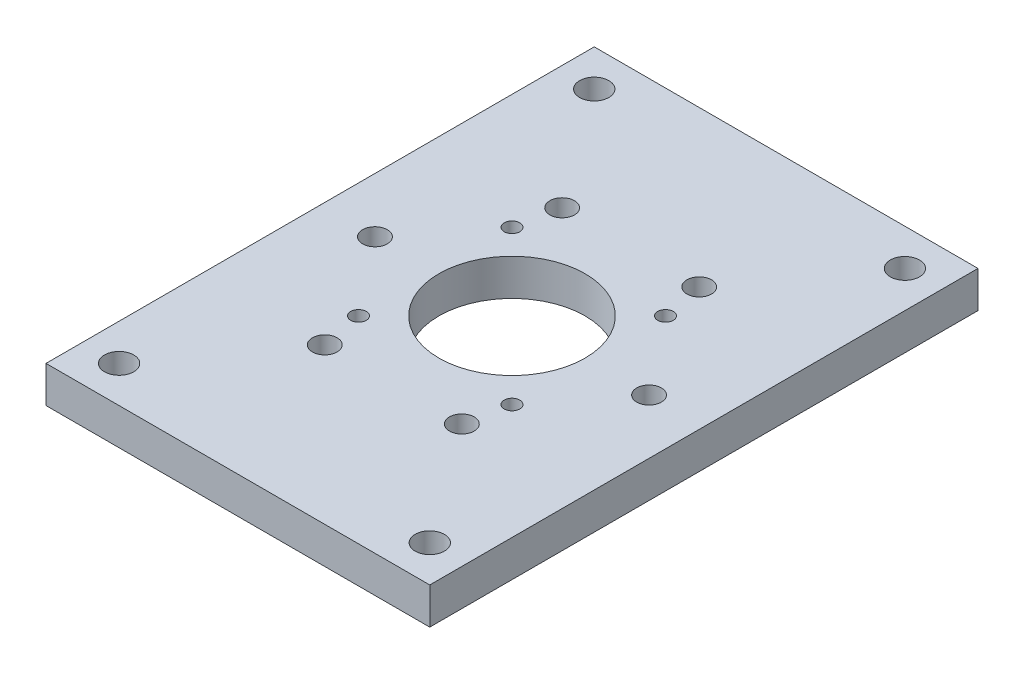
ISO-10303-21;
HEADER;
FILE_DESCRIPTION(('STEP AP214'),'2;1');
FILE_NAME('part.step','',(''),(''),'','','');
FILE_SCHEMA(('AUTOMOTIVE_DESIGN { 1 0 10303 214 1 1 1 1 }'));
ENDSEC;
DATA;
#1=APPLICATION_CONTEXT('core data for automotive mechanical design processes');
#2=APPLICATION_PROTOCOL_DEFINITION('international standard','automotive_design',2000,#1);
#3=PRODUCT_CONTEXT('',#1,'mechanical');
#4=PRODUCT('Part','Part','',(#3));
#5=PRODUCT_RELATED_PRODUCT_CATEGORY('part','',(#4));
#6=PRODUCT_DEFINITION_FORMATION('','',#4);
#7=PRODUCT_DEFINITION_CONTEXT('part definition',#1,'design');
#8=PRODUCT_DEFINITION('design','',#6,#7);
#9=PRODUCT_DEFINITION_SHAPE('','',#8);
#10=(LENGTH_UNIT() NAMED_UNIT(*) SI_UNIT(.MILLI.,.METRE.));
#11=(NAMED_UNIT(*) PLANE_ANGLE_UNIT() SI_UNIT($,.RADIAN.));
#12=(NAMED_UNIT(*) SI_UNIT($,.STERADIAN.) SOLID_ANGLE_UNIT());
#13=UNCERTAINTY_MEASURE_WITH_UNIT(LENGTH_MEASURE(1.E-05),#10,'distance_accuracy_value','');
#14=(GEOMETRIC_REPRESENTATION_CONTEXT(3) GLOBAL_UNCERTAINTY_ASSIGNED_CONTEXT((#13)) GLOBAL_UNIT_ASSIGNED_CONTEXT((#10,
#11,#12)) REPRESENTATION_CONTEXT('',''));
#15=CARTESIAN_POINT('',(0.,0.,0.));
#16=DIRECTION('',(0.,0.,1.));
#17=DIRECTION('',(1.,0.,0.));
#18=AXIS2_PLACEMENT_3D('',#15,#16,#17);
#19=CARTESIAN_POINT('',(0.,20.,0.));
#20=DIRECTION('',(0.,-1.,0.));
#21=DIRECTION('',(0.,0.,-1.));
#22=AXIS2_PLACEMENT_3D('',#19,#20,#21);
#23=PLANE('',#22);
#24=CARTESIAN_POINT('',(-41.9999999999996,20.,42.0000000000005));
#25=DIRECTION('',(0.,1.,0.));
#26=DIRECTION('',(0.,0.,1.));
#27=AXIS2_PLACEMENT_3D('',#24,#25,#26);
#28=CIRCLE('',#27,4.25);
#29=CARTESIAN_POINT('',(-41.9999999999996,20.,46.2500000000005));
#30=VERTEX_POINT('',#29);
#31=EDGE_CURVE('E19',#30,#30,#28,.F.);
#32=ORIENTED_EDGE('',*,*,#31,.T.);
#33=EDGE_LOOP('',(#32));
#34=FACE_BOUND('',#33,.T.);
#35=CARTESIAN_POINT('',(-42.,20.,-42.));
#36=DIRECTION('',(0.,1.,0.));
#37=DIRECTION('',(0.,0.,1.));
#38=AXIS2_PLACEMENT_3D('',#35,#36,#37);
#39=CIRCLE('',#38,4.25);
#40=CARTESIAN_POINT('',(-42.,20.,-37.75));
#41=VERTEX_POINT('',#40);
#42=EDGE_CURVE('E166',#41,#41,#39,.F.);
#43=ORIENTED_EDGE('',*,*,#42,.T.);
#44=EDGE_LOOP('',(#43));
#45=FACE_BOUND('',#44,.T.);
#46=CARTESIAN_POINT('',(42.,20.,-42.));
#47=DIRECTION('',(0.,1.,0.));
#48=DIRECTION('',(0.,0.,1.));
#49=AXIS2_PLACEMENT_3D('',#46,#47,#48);
#50=CIRCLE('',#49,4.25);
#51=CARTESIAN_POINT('',(42.,20.,-37.75));
#52=VERTEX_POINT('',#51);
#53=EDGE_CURVE('E164',#52,#52,#50,.F.);
#54=ORIENTED_EDGE('',*,*,#53,.T.);
#55=EDGE_LOOP('',(#54));
#56=FACE_BOUND('',#55,.T.);
#57=CARTESIAN_POINT('',(42.,20.,42.));
#58=DIRECTION('',(0.,1.,0.));
#59=DIRECTION('',(0.,0.,1.));
#60=AXIS2_PLACEMENT_3D('',#57,#58,#59);
#61=CIRCLE('',#60,4.25);
#62=CARTESIAN_POINT('',(42.,20.,46.25));
#63=VERTEX_POINT('',#62);
#64=EDGE_CURVE('E161',#63,#63,#61,.F.);
#65=ORIENTED_EDGE('',*,*,#64,.T.);
#66=EDGE_LOOP('',(#65));
#67=FACE_BOUND('',#66,.T.);
#68=CARTESIAN_POINT('',(-37.5000000000007,20.,-64.9519052838323));
#69=DIRECTION('',(0.,1.,0.));
#70=DIRECTION('',(0.,0.,1.));
#71=AXIS2_PLACEMENT_3D('',#68,#69,#70);
#72=CIRCLE('',#71,6.75);
#73=CARTESIAN_POINT('',(-37.5000000000007,20.,-58.2019052838323));
#74=VERTEX_POINT('',#73);
#75=EDGE_CURVE('E158',#74,#74,#72,.F.);
#76=ORIENTED_EDGE('',*,*,#75,.T.);
#77=EDGE_LOOP('',(#76));
#78=FACE_BOUND('',#77,.T.);
#79=CARTESIAN_POINT('',(37.4999999999993,20.,-64.9519052838331));
#80=DIRECTION('',(0.,1.,0.));
#81=DIRECTION('',(0.,0.,1.));
#82=AXIS2_PLACEMENT_3D('',#79,#80,#81);
#83=CIRCLE('',#82,6.75);
#84=CARTESIAN_POINT('',(37.4999999999993,20.,-58.2019052838331));
#85=VERTEX_POINT('',#84);
#86=EDGE_CURVE('E155',#85,#85,#83,.F.);
#87=ORIENTED_EDGE('',*,*,#86,.T.);
#88=EDGE_LOOP('',(#87));
#89=FACE_BOUND('',#88,.T.);
#90=CARTESIAN_POINT('',(75.,20.,0.));
#91=DIRECTION('',(0.,1.,0.));
#92=DIRECTION('',(0.,0.,1.));
#93=AXIS2_PLACEMENT_3D('',#90,#91,#92);
#94=CIRCLE('',#93,6.75);
#95=CARTESIAN_POINT('',(75.,20.,6.74999999999997));
#96=VERTEX_POINT('',#95);
#97=EDGE_CURVE('E152',#96,#96,#94,.F.);
#98=ORIENTED_EDGE('',*,*,#97,.T.);
#99=EDGE_LOOP('',(#98));
#100=FACE_BOUND('',#99,.T.);
#101=DIRECTION('',(1.,0.,0.));
#102=VECTOR('',#101,1.);
#103=CARTESIAN_POINT('',(-105.,20.,-150.));
#104=LINE('',#103,#102);
#105=CARTESIAN_POINT('',(105.,20.,-150.));
#106=VERTEX_POINT('',#105);
#107=CARTESIAN_POINT('',(-105.,20.,-150.));
#108=VERTEX_POINT('',#107);
#109=EDGE_CURVE('E453',#106,#108,#104,.F.);
#110=ORIENTED_EDGE('',*,*,#109,.T.);
#111=DIRECTION('',(0.,0.,-1.));
#112=VECTOR('',#111,1.);
#113=CARTESIAN_POINT('',(-105.,20.,150.));
#114=LINE('',#113,#112);
#115=CARTESIAN_POINT('',(-105.,20.,150.));
#116=VERTEX_POINT('',#115);
#117=EDGE_CURVE('E54',#108,#116,#114,.F.);
#118=ORIENTED_EDGE('',*,*,#117,.T.);
#119=DIRECTION('',(-1.,0.,0.));
#120=VECTOR('',#119,1.);
#121=CARTESIAN_POINT('',(-105.,20.,150.));
#122=LINE('',#121,#120);
#123=CARTESIAN_POINT('',(105.,20.,150.));
#124=VERTEX_POINT('',#123);
#125=EDGE_CURVE('E56',#116,#124,#122,.F.);
#126=ORIENTED_EDGE('',*,*,#125,.T.);
#127=DIRECTION('',(0.,0.,1.));
#128=VECTOR('',#127,1.);
#129=CARTESIAN_POINT('',(105.,20.,150.));
#130=LINE('',#129,#128);
#131=EDGE_CURVE('E59',#124,#106,#130,.F.);
#132=ORIENTED_EDGE('',*,*,#131,.T.);
#133=EDGE_LOOP('',(#110,#118,#126,#132));
#134=FACE_BOUND('',#133,.T.);
#135=CARTESIAN_POINT('',(0.,20.,0.));
#136=DIRECTION('',(0.,1.,0.));
#137=DIRECTION('',(0.,0.,1.));
#138=AXIS2_PLACEMENT_3D('',#135,#136,#137);
#139=CIRCLE('',#138,40.);
#140=CARTESIAN_POINT('',(0.,20.,40.));
#141=VERTEX_POINT('',#140);
#142=EDGE_CURVE('E72',#141,#141,#139,.F.);
#143=ORIENTED_EDGE('',*,*,#142,.T.);
#144=EDGE_LOOP('',(#143));
#145=FACE_BOUND('',#144,.T.);
#146=CARTESIAN_POINT('',(-85.,20.,-130.));
#147=DIRECTION('',(0.,1.,0.));
#148=DIRECTION('',(0.,0.,1.));
#149=AXIS2_PLACEMENT_3D('',#146,#147,#148);
#150=CIRCLE('',#149,8.);
#151=CARTESIAN_POINT('',(-85.,20.,-122.));
#152=VERTEX_POINT('',#151);
#153=EDGE_CURVE('E131',#152,#152,#150,.F.);
#154=ORIENTED_EDGE('',*,*,#153,.T.);
#155=EDGE_LOOP('',(#154));
#156=FACE_BOUND('',#155,.T.);
#157=CARTESIAN_POINT('',(-85.,20.,130.));
#158=DIRECTION('',(0.,1.,0.));
#159=DIRECTION('',(0.,0.,1.));
#160=AXIS2_PLACEMENT_3D('',#157,#158,#159);
#161=CIRCLE('',#160,8.);
#162=CARTESIAN_POINT('',(-85.,20.,138.));
#163=VERTEX_POINT('',#162);
#164=EDGE_CURVE('E134',#163,#163,#161,.F.);
#165=ORIENTED_EDGE('',*,*,#164,.T.);
#166=EDGE_LOOP('',(#165));
#167=FACE_BOUND('',#166,.T.);
#168=CARTESIAN_POINT('',(85.,20.,-130.));
#169=DIRECTION('',(0.,1.,0.));
#170=DIRECTION('',(0.,0.,1.));
#171=AXIS2_PLACEMENT_3D('',#168,#169,#170);
#172=CIRCLE('',#171,8.);
#173=CARTESIAN_POINT('',(85.,20.,-122.));
#174=VERTEX_POINT('',#173);
#175=EDGE_CURVE('E137',#174,#174,#172,.F.);
#176=ORIENTED_EDGE('',*,*,#175,.T.);
#177=EDGE_LOOP('',(#176));
#178=FACE_BOUND('',#177,.T.);
#179=CARTESIAN_POINT('',(85.,20.,130.));
#180=DIRECTION('',(0.,1.,0.));
#181=DIRECTION('',(0.,0.,1.));
#182=AXIS2_PLACEMENT_3D('',#179,#180,#181);
#183=CIRCLE('',#182,8.);
#184=CARTESIAN_POINT('',(85.,20.,138.));
#185=VERTEX_POINT('',#184);
#186=EDGE_CURVE('E140',#185,#185,#183,.F.);
#187=ORIENTED_EDGE('',*,*,#186,.T.);
#188=EDGE_LOOP('',(#187));
#189=FACE_BOUND('',#188,.T.);
#190=CARTESIAN_POINT('',(-75.,20.,0.));
#191=DIRECTION('',(0.,1.,0.));
#192=DIRECTION('',(0.,0.,1.));
#193=AXIS2_PLACEMENT_3D('',#190,#191,#192);
#194=CIRCLE('',#193,6.75);
#195=CARTESIAN_POINT('',(-75.,20.,6.75000000000003));
#196=VERTEX_POINT('',#195);
#197=EDGE_CURVE('E143',#196,#196,#194,.F.);
#198=ORIENTED_EDGE('',*,*,#197,.T.);
#199=EDGE_LOOP('',(#198));
#200=FACE_BOUND('',#199,.T.);
#201=CARTESIAN_POINT('',(-37.5,20.,64.9519052838329));
#202=DIRECTION('',(0.,1.,0.));
#203=DIRECTION('',(0.,0.,1.));
#204=AXIS2_PLACEMENT_3D('',#201,#202,#203);
#205=CIRCLE('',#204,6.75);
#206=CARTESIAN_POINT('',(-37.5,20.,71.7019052838329));
#207=VERTEX_POINT('',#206);
#208=EDGE_CURVE('E146',#207,#207,#205,.F.);
#209=ORIENTED_EDGE('',*,*,#208,.T.);
#210=EDGE_LOOP('',(#209));
#211=FACE_BOUND('',#210,.T.);
#212=CARTESIAN_POINT('',(37.5,20.,64.9519052838326));
#213=DIRECTION('',(0.,1.,0.));
#214=DIRECTION('',(0.,0.,1.));
#215=AXIS2_PLACEMENT_3D('',#212,#213,#214);
#216=CIRCLE('',#215,6.75);
#217=CARTESIAN_POINT('',(37.5,20.,71.7019052838326));
#218=VERTEX_POINT('',#217);
#219=EDGE_CURVE('E149',#218,#218,#216,.F.);
#220=ORIENTED_EDGE('',*,*,#219,.T.);
#221=EDGE_LOOP('',(#220));
#222=FACE_BOUND('',#221,.T.);
#223=ADVANCED_FACE('F16',(#34,#45,#56,#67,#78,#89,#100,#134,#145,#156,#167,#178,#189,#200,#211,
#222),#23,.F.);
#224=CARTESIAN_POINT('',(-41.9999999999996,20.,42.0000000000005));
#225=DIRECTION('',(0.,1.,0.));
#226=DIRECTION('',(0.,0.,1.));
#227=AXIS2_PLACEMENT_3D('',#224,#225,#226);
#228=CYLINDRICAL_SURFACE('',#227,4.25);
#229=CARTESIAN_POINT('',(-41.9999999999996,0.,42.0000000000005));
#230=DIRECTION('',(0.,1.,0.));
#231=DIRECTION('',(0.,0.,1.));
#232=AXIS2_PLACEMENT_3D('',#229,#230,#231);
#233=CIRCLE('',#232,4.25);
#234=CARTESIAN_POINT('',(-41.9999999999996,0.,46.2500000000005));
#235=VERTEX_POINT('',#234);
#236=EDGE_CURVE('E126',#235,#235,#233,.T.);
#237=ORIENTED_EDGE('',*,*,#236,.F.);
#238=EDGE_LOOP('',(#237));
#239=FACE_BOUND('',#238,.T.);
#240=ORIENTED_EDGE('',*,*,#31,.F.);
#241=EDGE_LOOP('',(#240));
#242=FACE_BOUND('',#241,.T.);
#243=ADVANCED_FACE('F174',(#239,#242),#228,.F.);
#244=CARTESIAN_POINT('',(-42.,20.,-42.));
#245=DIRECTION('',(0.,1.,0.));
#246=DIRECTION('',(0.,0.,1.));
#247=AXIS2_PLACEMENT_3D('',#244,#245,#246);
#248=CYLINDRICAL_SURFACE('',#247,4.25);
#249=CARTESIAN_POINT('',(-42.,0.,-42.));
#250=DIRECTION('',(0.,1.,0.));
#251=DIRECTION('',(0.,0.,1.));
#252=AXIS2_PLACEMENT_3D('',#249,#250,#251);
#253=CIRCLE('',#252,4.25);
#254=CARTESIAN_POINT('',(-42.,0.,-37.75));
#255=VERTEX_POINT('',#254);
#256=EDGE_CURVE('E123',#255,#255,#253,.T.);
#257=ORIENTED_EDGE('',*,*,#256,.F.);
#258=EDGE_LOOP('',(#257));
#259=FACE_BOUND('',#258,.T.);
#260=ORIENTED_EDGE('',*,*,#42,.F.);
#261=EDGE_LOOP('',(#260));
#262=FACE_BOUND('',#261,.T.);
#263=ADVANCED_FACE('F176',(#259,#262),#248,.F.);
#264=CARTESIAN_POINT('',(42.,20.,-42.));
#265=DIRECTION('',(0.,1.,0.));
#266=DIRECTION('',(0.,0.,1.));
#267=AXIS2_PLACEMENT_3D('',#264,#265,#266);
#268=CYLINDRICAL_SURFACE('',#267,4.25);
#269=CARTESIAN_POINT('',(42.,0.,-42.));
#270=DIRECTION('',(0.,1.,0.));
#271=DIRECTION('',(0.,0.,1.));
#272=AXIS2_PLACEMENT_3D('',#269,#270,#271);
#273=CIRCLE('',#272,4.25);
#274=CARTESIAN_POINT('',(42.,0.,-37.75));
#275=VERTEX_POINT('',#274);
#276=EDGE_CURVE('E120',#275,#275,#273,.T.);
#277=ORIENTED_EDGE('',*,*,#276,.F.);
#278=EDGE_LOOP('',(#277));
#279=FACE_BOUND('',#278,.T.);
#280=ORIENTED_EDGE('',*,*,#53,.F.);
#281=EDGE_LOOP('',(#280));
#282=FACE_BOUND('',#281,.T.);
#283=ADVANCED_FACE('F184',(#279,#282),#268,.F.);
#284=CARTESIAN_POINT('',(42.,20.,42.));
#285=DIRECTION('',(0.,1.,0.));
#286=DIRECTION('',(0.,0.,1.));
#287=AXIS2_PLACEMENT_3D('',#284,#285,#286);
#288=CYLINDRICAL_SURFACE('',#287,4.25);
#289=CARTESIAN_POINT('',(42.,0.,42.));
#290=DIRECTION('',(0.,1.,0.));
#291=DIRECTION('',(0.,0.,1.));
#292=AXIS2_PLACEMENT_3D('',#289,#290,#291);
#293=CIRCLE('',#292,4.25);
#294=CARTESIAN_POINT('',(42.,0.,46.25));
#295=VERTEX_POINT('',#294);
#296=EDGE_CURVE('E117',#295,#295,#293,.T.);
#297=ORIENTED_EDGE('',*,*,#296,.F.);
#298=EDGE_LOOP('',(#297));
#299=FACE_BOUND('',#298,.T.);
#300=ORIENTED_EDGE('',*,*,#64,.F.);
#301=EDGE_LOOP('',(#300));
#302=FACE_BOUND('',#301,.T.);
#303=ADVANCED_FACE('F252',(#299,#302),#288,.F.);
#304=CARTESIAN_POINT('',(-37.5000000000007,20.,-64.9519052838323));
#305=DIRECTION('',(0.,1.,0.));
#306=DIRECTION('',(0.,0.,1.));
#307=AXIS2_PLACEMENT_3D('',#304,#305,#306);
#308=CYLINDRICAL_SURFACE('',#307,6.75);
#309=ORIENTED_EDGE('',*,*,#75,.F.);
#310=EDGE_LOOP('',(#309));
#311=FACE_BOUND('',#310,.T.);
#312=CARTESIAN_POINT('',(-37.5000000000007,0.,-64.9519052838323));
#313=DIRECTION('',(0.,1.,0.));
#314=DIRECTION('',(0.,0.,1.));
#315=AXIS2_PLACEMENT_3D('',#312,#313,#314);
#316=CIRCLE('',#315,6.75);
#317=CARTESIAN_POINT('',(-37.5000000000007,0.,-58.2019052838323));
#318=VERTEX_POINT('',#317);
#319=EDGE_CURVE('E114',#318,#318,#316,.T.);
#320=ORIENTED_EDGE('',*,*,#319,.F.);
#321=EDGE_LOOP('',(#320));
#322=FACE_BOUND('',#321,.T.);
#323=ADVANCED_FACE('F248',(#311,#322),#308,.F.);
#324=CARTESIAN_POINT('',(37.4999999999993,20.,-64.9519052838331));
#325=DIRECTION('',(0.,1.,0.));
#326=DIRECTION('',(0.,0.,1.));
#327=AXIS2_PLACEMENT_3D('',#324,#325,#326);
#328=CYLINDRICAL_SURFACE('',#327,6.75);
#329=ORIENTED_EDGE('',*,*,#86,.F.);
#330=EDGE_LOOP('',(#329));
#331=FACE_BOUND('',#330,.T.);
#332=CARTESIAN_POINT('',(37.4999999999993,0.,-64.9519052838331));
#333=DIRECTION('',(0.,1.,0.));
#334=DIRECTION('',(0.,0.,1.));
#335=AXIS2_PLACEMENT_3D('',#332,#333,#334);
#336=CIRCLE('',#335,6.75);
#337=CARTESIAN_POINT('',(37.4999999999993,0.,-58.2019052838331));
#338=VERTEX_POINT('',#337);
#339=EDGE_CURVE('E111',#338,#338,#336,.T.);
#340=ORIENTED_EDGE('',*,*,#339,.F.);
#341=EDGE_LOOP('',(#340));
#342=FACE_BOUND('',#341,.T.);
#343=ADVANCED_FACE('F244',(#331,#342),#328,.F.);
#344=CARTESIAN_POINT('',(75.,20.,0.));
#345=DIRECTION('',(0.,1.,0.));
#346=DIRECTION('',(0.,0.,1.));
#347=AXIS2_PLACEMENT_3D('',#344,#345,#346);
#348=CYLINDRICAL_SURFACE('',#347,6.75);
#349=ORIENTED_EDGE('',*,*,#97,.F.);
#350=EDGE_LOOP('',(#349));
#351=FACE_BOUND('',#350,.T.);
#352=CARTESIAN_POINT('',(75.,0.,0.));
#353=DIRECTION('',(0.,1.,0.));
#354=DIRECTION('',(0.,0.,1.));
#355=AXIS2_PLACEMENT_3D('',#352,#353,#354);
#356=CIRCLE('',#355,6.75);
#357=CARTESIAN_POINT('',(75.,0.,6.74999999999997));
#358=VERTEX_POINT('',#357);
#359=EDGE_CURVE('E108',#358,#358,#356,.T.);
#360=ORIENTED_EDGE('',*,*,#359,.F.);
#361=EDGE_LOOP('',(#360));
#362=FACE_BOUND('',#361,.T.);
#363=ADVANCED_FACE('F240',(#351,#362),#348,.F.);
#364=CARTESIAN_POINT('',(37.5,20.,64.9519052838326));
#365=DIRECTION('',(0.,1.,0.));
#366=DIRECTION('',(0.,0.,1.));
#367=AXIS2_PLACEMENT_3D('',#364,#365,#366);
#368=CYLINDRICAL_SURFACE('',#367,6.75);
#369=ORIENTED_EDGE('',*,*,#219,.F.);
#370=EDGE_LOOP('',(#369));
#371=FACE_BOUND('',#370,.T.);
#372=CARTESIAN_POINT('',(37.5,0.,64.9519052838326));
#373=DIRECTION('',(0.,1.,0.));
#374=DIRECTION('',(0.,0.,1.));
#375=AXIS2_PLACEMENT_3D('',#372,#373,#374);
#376=CIRCLE('',#375,6.75);
#377=CARTESIAN_POINT('',(37.5,0.,71.7019052838326));
#378=VERTEX_POINT('',#377);
#379=EDGE_CURVE('E105',#378,#378,#376,.T.);
#380=ORIENTED_EDGE('',*,*,#379,.F.);
#381=EDGE_LOOP('',(#380));
#382=FACE_BOUND('',#381,.T.);
#383=ADVANCED_FACE('F236',(#371,#382),#368,.F.);
#384=CARTESIAN_POINT('',(-37.5,20.,64.9519052838329));
#385=DIRECTION('',(0.,1.,0.));
#386=DIRECTION('',(0.,0.,1.));
#387=AXIS2_PLACEMENT_3D('',#384,#385,#386);
#388=CYLINDRICAL_SURFACE('',#387,6.75);
#389=ORIENTED_EDGE('',*,*,#208,.F.);
#390=EDGE_LOOP('',(#389));
#391=FACE_BOUND('',#390,.T.);
#392=CARTESIAN_POINT('',(-37.5,0.,64.9519052838329));
#393=DIRECTION('',(0.,1.,0.));
#394=DIRECTION('',(0.,0.,1.));
#395=AXIS2_PLACEMENT_3D('',#392,#393,#394);
#396=CIRCLE('',#395,6.75);
#397=CARTESIAN_POINT('',(-37.5,0.,71.7019052838329));
#398=VERTEX_POINT('',#397);
#399=EDGE_CURVE('E102',#398,#398,#396,.T.);
#400=ORIENTED_EDGE('',*,*,#399,.F.);
#401=EDGE_LOOP('',(#400));
#402=FACE_BOUND('',#401,.T.);
#403=ADVANCED_FACE('F232',(#391,#402),#388,.F.);
#404=CARTESIAN_POINT('',(-75.,20.,0.));
#405=DIRECTION('',(0.,1.,0.));
#406=DIRECTION('',(0.,0.,1.));
#407=AXIS2_PLACEMENT_3D('',#404,#405,#406);
#408=CYLINDRICAL_SURFACE('',#407,6.75);
#409=ORIENTED_EDGE('',*,*,#197,.F.);
#410=EDGE_LOOP('',(#409));
#411=FACE_BOUND('',#410,.T.);
#412=CARTESIAN_POINT('',(-75.,0.,0.));
#413=DIRECTION('',(0.,1.,0.));
#414=DIRECTION('',(0.,0.,1.));
#415=AXIS2_PLACEMENT_3D('',#412,#413,#414);
#416=CIRCLE('',#415,6.75);
#417=CARTESIAN_POINT('',(-75.,0.,6.75000000000003));
#418=VERTEX_POINT('',#417);
#419=EDGE_CURVE('E99',#418,#418,#416,.T.);
#420=ORIENTED_EDGE('',*,*,#419,.F.);
#421=EDGE_LOOP('',(#420));
#422=FACE_BOUND('',#421,.T.);
#423=ADVANCED_FACE('F228',(#411,#422),#408,.F.);
#424=CARTESIAN_POINT('',(85.,20.,130.));
#425=DIRECTION('',(0.,1.,0.));
#426=DIRECTION('',(0.,0.,1.));
#427=AXIS2_PLACEMENT_3D('',#424,#425,#426);
#428=CYLINDRICAL_SURFACE('',#427,8.);
#429=ORIENTED_EDGE('',*,*,#186,.F.);
#430=EDGE_LOOP('',(#429));
#431=FACE_BOUND('',#430,.T.);
#432=CARTESIAN_POINT('',(85.,0.,130.));
#433=DIRECTION('',(0.,1.,0.));
#434=DIRECTION('',(0.,0.,1.));
#435=AXIS2_PLACEMENT_3D('',#432,#433,#434);
#436=CIRCLE('',#435,8.);
#437=CARTESIAN_POINT('',(85.,0.,138.));
#438=VERTEX_POINT('',#437);
#439=EDGE_CURVE('E96',#438,#438,#436,.T.);
#440=ORIENTED_EDGE('',*,*,#439,.F.);
#441=EDGE_LOOP('',(#440));
#442=FACE_BOUND('',#441,.T.);
#443=ADVANCED_FACE('F224',(#431,#442),#428,.F.);
#444=CARTESIAN_POINT('',(85.,20.,-130.));
#445=DIRECTION('',(0.,1.,0.));
#446=DIRECTION('',(0.,0.,1.));
#447=AXIS2_PLACEMENT_3D('',#444,#445,#446);
#448=CYLINDRICAL_SURFACE('',#447,8.);
#449=ORIENTED_EDGE('',*,*,#175,.F.);
#450=EDGE_LOOP('',(#449));
#451=FACE_BOUND('',#450,.T.);
#452=CARTESIAN_POINT('',(85.,0.,-130.));
#453=DIRECTION('',(0.,1.,0.));
#454=DIRECTION('',(0.,0.,1.));
#455=AXIS2_PLACEMENT_3D('',#452,#453,#454);
#456=CIRCLE('',#455,8.);
#457=CARTESIAN_POINT('',(85.,0.,-122.));
#458=VERTEX_POINT('',#457);
#459=EDGE_CURVE('E93',#458,#458,#456,.T.);
#460=ORIENTED_EDGE('',*,*,#459,.F.);
#461=EDGE_LOOP('',(#460));
#462=FACE_BOUND('',#461,.T.);
#463=ADVANCED_FACE('F220',(#451,#462),#448,.F.);
#464=CARTESIAN_POINT('',(-85.,20.,130.));
#465=DIRECTION('',(0.,1.,0.));
#466=DIRECTION('',(0.,0.,1.));
#467=AXIS2_PLACEMENT_3D('',#464,#465,#466);
#468=CYLINDRICAL_SURFACE('',#467,8.);
#469=ORIENTED_EDGE('',*,*,#164,.F.);
#470=EDGE_LOOP('',(#469));
#471=FACE_BOUND('',#470,.T.);
#472=CARTESIAN_POINT('',(-85.,0.,130.));
#473=DIRECTION('',(0.,1.,0.));
#474=DIRECTION('',(0.,0.,1.));
#475=AXIS2_PLACEMENT_3D('',#472,#473,#474);
#476=CIRCLE('',#475,8.);
#477=CARTESIAN_POINT('',(-85.,0.,138.));
#478=VERTEX_POINT('',#477);
#479=EDGE_CURVE('E90',#478,#478,#476,.T.);
#480=ORIENTED_EDGE('',*,*,#479,.F.);
#481=EDGE_LOOP('',(#480));
#482=FACE_BOUND('',#481,.T.);
#483=ADVANCED_FACE('F216',(#471,#482),#468,.F.);
#484=CARTESIAN_POINT('',(-85.,20.,-130.));
#485=DIRECTION('',(0.,1.,0.));
#486=DIRECTION('',(0.,0.,1.));
#487=AXIS2_PLACEMENT_3D('',#484,#485,#486);
#488=CYLINDRICAL_SURFACE('',#487,8.);
#489=ORIENTED_EDGE('',*,*,#153,.F.);
#490=EDGE_LOOP('',(#489));
#491=FACE_BOUND('',#490,.T.);
#492=CARTESIAN_POINT('',(-85.,0.,-130.));
#493=DIRECTION('',(0.,1.,0.));
#494=DIRECTION('',(0.,0.,1.));
#495=AXIS2_PLACEMENT_3D('',#492,#493,#494);
#496=CIRCLE('',#495,8.);
#497=CARTESIAN_POINT('',(-85.,0.,-122.));
#498=VERTEX_POINT('',#497);
#499=EDGE_CURVE('E87',#498,#498,#496,.T.);
#500=ORIENTED_EDGE('',*,*,#499,.F.);
#501=EDGE_LOOP('',(#500));
#502=FACE_BOUND('',#501,.T.);
#503=ADVANCED_FACE('F212',(#491,#502),#488,.F.);
#504=CARTESIAN_POINT('',(0.,0.,0.));
#505=DIRECTION('',(0.,1.,0.));
#506=DIRECTION('',(0.,0.,1.));
#507=AXIS2_PLACEMENT_3D('',#504,#505,#506);
#508=CYLINDRICAL_SURFACE('',#507,40.);
#509=ORIENTED_EDGE('',*,*,#142,.F.);
#510=EDGE_LOOP('',(#509));
#511=FACE_BOUND('',#510,.T.);
#512=CARTESIAN_POINT('',(0.,0.,0.));
#513=DIRECTION('',(0.,1.,0.));
#514=DIRECTION('',(0.,0.,1.));
#515=AXIS2_PLACEMENT_3D('',#512,#513,#514);
#516=CIRCLE('',#515,40.);
#517=CARTESIAN_POINT('',(0.,0.,40.));
#518=VERTEX_POINT('',#517);
#519=EDGE_CURVE('E83',#518,#518,#516,.T.);
#520=ORIENTED_EDGE('',*,*,#519,.F.);
#521=EDGE_LOOP('',(#520));
#522=FACE_BOUND('',#521,.T.);
#523=ADVANCED_FACE('F209',(#511,#522),#508,.F.);
#524=CARTESIAN_POINT('',(105.,20.,150.));
#525=DIRECTION('',(-1.,0.,0.));
#526=DIRECTION('',(0.,0.,1.));
#527=AXIS2_PLACEMENT_3D('',#524,#525,#526);
#528=PLANE('',#527);
#529=DIRECTION('',(0.,1.,0.));
#530=VECTOR('',#529,1.);
#531=CARTESIAN_POINT('',(105.,20.,-150.));
#532=LINE('',#531,#530);
#533=CARTESIAN_POINT('',(105.,0.,-150.));
#534=VERTEX_POINT('',#533);
#535=EDGE_CURVE('E70',#534,#106,#532,.T.);
#536=ORIENTED_EDGE('',*,*,#535,.T.);
#537=ORIENTED_EDGE('',*,*,#131,.F.);
#538=DIRECTION('',(0.,1.,0.));
#539=VECTOR('',#538,1.);
#540=CARTESIAN_POINT('',(105.,20.,150.));
#541=LINE('',#540,#539);
#542=CARTESIAN_POINT('',(105.,0.,150.));
#543=VERTEX_POINT('',#542);
#544=EDGE_CURVE('E64',#124,#543,#541,.F.);
#545=ORIENTED_EDGE('',*,*,#544,.T.);
#546=DIRECTION('',(0.,0.,-1.));
#547=VECTOR('',#546,1.);
#548=CARTESIAN_POINT('',(105.,0.,0.));
#549=LINE('',#548,#547);
#550=EDGE_CURVE('E86',#534,#543,#549,.F.);
#551=ORIENTED_EDGE('',*,*,#550,.F.);
#552=EDGE_LOOP('',(#536,#537,#545,#551));
#553=FACE_BOUND('',#552,.T.);
#554=ADVANCED_FACE('F67',(#553),#528,.F.);
#555=CARTESIAN_POINT('',(-105.,20.,150.));
#556=DIRECTION('',(0.,0.,-1.));
#557=DIRECTION('',(-1.,0.,0.));
#558=AXIS2_PLACEMENT_3D('',#555,#556,#557);
#559=PLANE('',#558);
#560=ORIENTED_EDGE('',*,*,#544,.F.);
#561=ORIENTED_EDGE('',*,*,#125,.F.);
#562=DIRECTION('',(0.,1.,0.));
#563=VECTOR('',#562,1.);
#564=CARTESIAN_POINT('',(-105.,20.,150.));
#565=LINE('',#564,#563);
#566=CARTESIAN_POINT('',(-105.,0.,150.));
#567=VERTEX_POINT('',#566);
#568=EDGE_CURVE('E79',#116,#567,#565,.F.);
#569=ORIENTED_EDGE('',*,*,#568,.T.);
#570=DIRECTION('',(1.,0.,0.));
#571=VECTOR('',#570,1.);
#572=CARTESIAN_POINT('',(0.,0.,150.));
#573=LINE('',#572,#571);
#574=EDGE_CURVE('E76',#543,#567,#573,.F.);
#575=ORIENTED_EDGE('',*,*,#574,.F.);
#576=EDGE_LOOP('',(#560,#561,#569,#575));
#577=FACE_BOUND('',#576,.T.);
#578=ADVANCED_FACE('F74',(#577),#559,.F.);
#579=CARTESIAN_POINT('',(-105.,20.,150.));
#580=DIRECTION('',(1.,0.,0.));
#581=DIRECTION('',(0.,0.,-1.));
#582=AXIS2_PLACEMENT_3D('',#579,#580,#581);
#583=PLANE('',#582);
#584=ORIENTED_EDGE('',*,*,#568,.F.);
#585=ORIENTED_EDGE('',*,*,#117,.F.);
#586=DIRECTION('',(0.,1.,0.));
#587=VECTOR('',#586,1.);
#588=CARTESIAN_POINT('',(-105.,20.,-150.));
#589=LINE('',#588,#587);
#590=CARTESIAN_POINT('',(-105.,0.,-150.));
#591=VERTEX_POINT('',#590);
#592=EDGE_CURVE('E34',#108,#591,#589,.F.);
#593=ORIENTED_EDGE('',*,*,#592,.T.);
#594=DIRECTION('',(0.,0.,-1.));
#595=VECTOR('',#594,1.);
#596=CARTESIAN_POINT('',(-105.,0.,0.));
#597=LINE('',#596,#595);
#598=EDGE_CURVE('E25',#567,#591,#597,.T.);
#599=ORIENTED_EDGE('',*,*,#598,.F.);
#600=EDGE_LOOP('',(#584,#585,#593,#599));
#601=FACE_BOUND('',#600,.T.);
#602=ADVANCED_FACE('F197',(#601),#583,.F.);
#603=CARTESIAN_POINT('',(-105.,20.,-150.));
#604=DIRECTION('',(0.,0.,1.));
#605=DIRECTION('',(1.,0.,0.));
#606=AXIS2_PLACEMENT_3D('',#603,#604,#605);
#607=PLANE('',#606);
#608=ORIENTED_EDGE('',*,*,#592,.F.);
#609=ORIENTED_EDGE('',*,*,#109,.F.);
#610=ORIENTED_EDGE('',*,*,#535,.F.);
#611=DIRECTION('',(1.,0.,0.));
#612=VECTOR('',#611,1.);
#613=CARTESIAN_POINT('',(0.,0.,-150.));
#614=LINE('',#613,#612);
#615=EDGE_CURVE('E11',#591,#534,#614,.T.);
#616=ORIENTED_EDGE('',*,*,#615,.F.);
#617=EDGE_LOOP('',(#608,#609,#610,#616));
#618=FACE_BOUND('',#617,.T.);
#619=ADVANCED_FACE('F190',(#618),#607,.F.);
#620=CARTESIAN_POINT('',(0.,0.,0.));
#621=DIRECTION('',(0.,-1.,0.));
#622=DIRECTION('',(0.,0.,-1.));
#623=AXIS2_PLACEMENT_3D('',#620,#621,#622);
#624=PLANE('',#623);
#625=ORIENTED_EDGE('',*,*,#598,.T.);
#626=ORIENTED_EDGE('',*,*,#615,.T.);
#627=ORIENTED_EDGE('',*,*,#550,.T.);
#628=ORIENTED_EDGE('',*,*,#574,.T.);
#629=EDGE_LOOP('',(#625,#626,#627,#628));
#630=FACE_BOUND('',#629,.T.);
#631=ORIENTED_EDGE('',*,*,#519,.T.);
#632=EDGE_LOOP('',(#631));
#633=FACE_BOUND('',#632,.T.);
#634=ORIENTED_EDGE('',*,*,#499,.T.);
#635=EDGE_LOOP('',(#634));
#636=FACE_BOUND('',#635,.T.);
#637=ORIENTED_EDGE('',*,*,#479,.T.);
#638=EDGE_LOOP('',(#637));
#639=FACE_BOUND('',#638,.T.);
#640=ORIENTED_EDGE('',*,*,#459,.T.);
#641=EDGE_LOOP('',(#640));
#642=FACE_BOUND('',#641,.T.);
#643=ORIENTED_EDGE('',*,*,#439,.T.);
#644=EDGE_LOOP('',(#643));
#645=FACE_BOUND('',#644,.T.);
#646=ORIENTED_EDGE('',*,*,#419,.T.);
#647=EDGE_LOOP('',(#646));
#648=FACE_BOUND('',#647,.T.);
#649=ORIENTED_EDGE('',*,*,#399,.T.);
#650=EDGE_LOOP('',(#649));
#651=FACE_BOUND('',#650,.T.);
#652=ORIENTED_EDGE('',*,*,#379,.T.);
#653=EDGE_LOOP('',(#652));
#654=FACE_BOUND('',#653,.T.);
#655=ORIENTED_EDGE('',*,*,#359,.T.);
#656=EDGE_LOOP('',(#655));
#657=FACE_BOUND('',#656,.T.);
#658=ORIENTED_EDGE('',*,*,#339,.T.);
#659=EDGE_LOOP('',(#658));
#660=FACE_BOUND('',#659,.T.);
#661=ORIENTED_EDGE('',*,*,#319,.T.);
#662=EDGE_LOOP('',(#661));
#663=FACE_BOUND('',#662,.T.);
#664=ORIENTED_EDGE('',*,*,#296,.T.);
#665=EDGE_LOOP('',(#664));
#666=FACE_BOUND('',#665,.T.);
#667=ORIENTED_EDGE('',*,*,#276,.T.);
#668=EDGE_LOOP('',(#667));
#669=FACE_BOUND('',#668,.T.);
#670=ORIENTED_EDGE('',*,*,#256,.T.);
#671=EDGE_LOOP('',(#670));
#672=FACE_BOUND('',#671,.T.);
#673=ORIENTED_EDGE('',*,*,#236,.T.);
#674=EDGE_LOOP('',(#673));
#675=FACE_BOUND('',#674,.T.);
#676=ADVANCED_FACE('F188',(#630,#633,#636,#639,#642,#645,#648,#651,#654,#657,#660,#663,#666,
#669,#672,#675),#624,.T.);
#677=CLOSED_SHELL('',(#223,#243,#263,#283,#303,#323,#343,#363,#383,#403,#423,#443,#463,#483,
#503,#523,#554,#578,#602,#619,#676));
#678=MANIFOLD_SOLID_BREP('B1',#677);
#679=ADVANCED_BREP_SHAPE_REPRESENTATION('',(#18,#678),#14);
#680=SHAPE_DEFINITION_REPRESENTATION(#9,#679);
ENDSEC;
END-ISO-10303-21;
